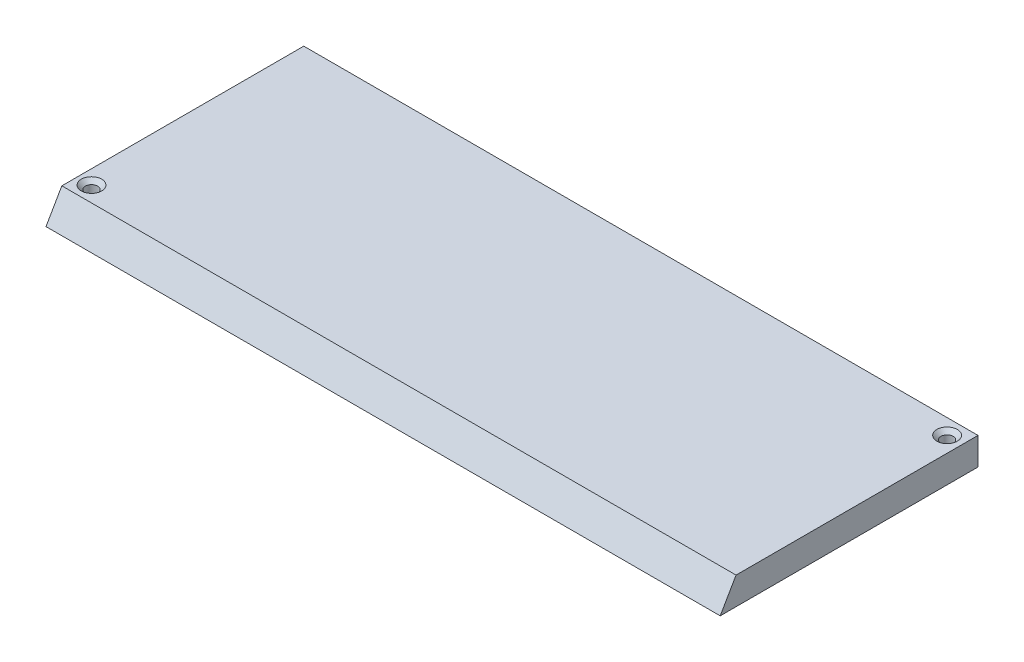
ISO-10303-21;
HEADER;
FILE_DESCRIPTION(('STEP AP214'),'2;1');
FILE_NAME('part.step','',(''),(''),'','','');
FILE_SCHEMA(('AUTOMOTIVE_DESIGN { 1 0 10303 214 1 1 1 1 }'));
ENDSEC;
DATA;
#1=APPLICATION_CONTEXT('core data for automotive mechanical design processes');
#2=APPLICATION_PROTOCOL_DEFINITION('international standard','automotive_design',2000,#1);
#3=PRODUCT_CONTEXT('',#1,'mechanical');
#4=PRODUCT('Part','Part','',(#3));
#5=PRODUCT_RELATED_PRODUCT_CATEGORY('part','',(#4));
#6=PRODUCT_DEFINITION_FORMATION('','',#4);
#7=PRODUCT_DEFINITION_CONTEXT('part definition',#1,'design');
#8=PRODUCT_DEFINITION('design','',#6,#7);
#9=PRODUCT_DEFINITION_SHAPE('','',#8);
#10=(LENGTH_UNIT() NAMED_UNIT(*) SI_UNIT(.MILLI.,.METRE.));
#11=(NAMED_UNIT(*) PLANE_ANGLE_UNIT() SI_UNIT($,.RADIAN.));
#12=(NAMED_UNIT(*) SI_UNIT($,.STERADIAN.) SOLID_ANGLE_UNIT());
#13=UNCERTAINTY_MEASURE_WITH_UNIT(LENGTH_MEASURE(1.E-05),#10,'distance_accuracy_value','');
#14=(GEOMETRIC_REPRESENTATION_CONTEXT(3) GLOBAL_UNCERTAINTY_ASSIGNED_CONTEXT((#13)) GLOBAL_UNIT_ASSIGNED_CONTEXT((#10,
#11,#12)) REPRESENTATION_CONTEXT('',''));
#15=CARTESIAN_POINT('',(0.,0.,0.));
#16=DIRECTION('',(0.,0.,1.));
#17=DIRECTION('',(1.,0.,0.));
#18=AXIS2_PLACEMENT_3D('',#15,#16,#17);
#19=CARTESIAN_POINT('',(0.,44.0009761145526,-0.000964457278402772));
#20=DIRECTION('',(0.,-0.999999999759779,2.19189973345185E-05));
#21=DIRECTION('',(0.,-2.19189973345185E-05,-0.999999999759779));
#22=AXIS2_PLACEMENT_3D('',#19,#20,#21);
#23=PLANE('',#22);
#24=CARTESIAN_POINT('',(193.442926912,43.998374470899,-118.694516600453));
#25=DIRECTION('',(0.,-0.999999999759779,2.19189973345185E-05));
#26=DIRECTION('',(0.,2.19189973345185E-05,0.999999999759779));
#27=AXIS2_PLACEMENT_3D('',#24,#25,#26);
#28=ELLIPSE('',#27,1.80000000043239,1.8);
#29=CARTESIAN_POINT('',(193.442926912,43.9984139250942,-116.894516600453));
#30=VERTEX_POINT('',#29);
#31=EDGE_CURVE('E41',#30,#30,#28,.T.);
#32=ORIENTED_EDGE('',*,*,#31,.F.);
#33=EDGE_LOOP('',(#32));
#34=FACE_BOUND('',#33,.T.);
#35=CARTESIAN_POINT('',(4.16488542546127,43.9997331425506,-56.7084854597657));
#36=DIRECTION('',(0.,-0.999999999759779,2.19189973345185E-05));
#37=DIRECTION('',(0.,2.19189973345185E-05,0.999999999759779));
#38=AXIS2_PLACEMENT_3D('',#35,#36,#37);
#39=ELLIPSE('',#38,1.80000000043239,1.79999999999999);
#40=CARTESIAN_POINT('',(4.16488542546127,43.9997725967458,-54.9084854597657));
#41=VERTEX_POINT('',#40);
#42=EDGE_CURVE('E95',#41,#41,#39,.T.);
#43=ORIENTED_EDGE('',*,*,#42,.F.);
#44=EDGE_LOOP('',(#43));
#45=FACE_BOUND('',#44,.T.);
#46=DIRECTION('',(1.,0.,0.));
#47=VECTOR('',#46,1.);
#48=CARTESIAN_POINT('',(0.,43.9999347591762,-47.5102259558685));
#49=LINE('',#48,#47);
#50=CARTESIAN_POINT('',(0.,43.9999347591762,-47.5102259558685));
#51=VERTEX_POINT('',#50);
#52=CARTESIAN_POINT('',(198.,43.9999347591762,-47.5102259558685));
#53=VERTEX_POINT('',#52);
#54=EDGE_CURVE('E82',#51,#53,#49,.T.);
#55=ORIENTED_EDGE('',*,*,#54,.F.);
#56=DIRECTION('',(0.,-2.19189973345185E-05,-0.999999999759779));
#57=VECTOR('',#56,1.);
#58=CARTESIAN_POINT('',(0.,44.0009761145526,-0.000964457278402773));
#59=LINE('',#58,#57);
#60=CARTESIAN_POINT('',(0.,43.9982754039967,-123.214198806139));
#61=VERTEX_POINT('',#60);
#62=EDGE_CURVE('E84',#51,#61,#59,.T.);
#63=ORIENTED_EDGE('',*,*,#62,.T.);
#64=DIRECTION('',(-1.,0.,0.));
#65=VECTOR('',#64,1.);
#66=CARTESIAN_POINT('',(0.,43.9982754039967,-123.214198806139));
#67=LINE('',#66,#65);
#68=CARTESIAN_POINT('',(198.,43.9982754039967,-123.214198806139));
#69=VERTEX_POINT('',#68);
#70=EDGE_CURVE('E74',#69,#61,#67,.T.);
#71=ORIENTED_EDGE('',*,*,#70,.F.);
#72=DIRECTION('',(0.,-2.19189973345185E-05,-0.999999999759779));
#73=VECTOR('',#72,1.);
#74=CARTESIAN_POINT('',(198.,44.0009761145526,-0.000964457278402773));
#75=LINE('',#74,#73);
#76=EDGE_CURVE('E86',#53,#69,#75,.T.);
#77=ORIENTED_EDGE('',*,*,#76,.F.);
#78=EDGE_LOOP('',(#55,#63,#71,#77));
#79=FACE_BOUND('',#78,.T.);
#80=ADVANCED_FACE('F37',(#34,#45,#79),#23,.T.);
#81=CARTESIAN_POINT('',(0.,52.0482754030357,-123.214198806139));
#82=DIRECTION('',(0.,1.,0.));
#83=DIRECTION('',(0.,0.,1.));
#84=AXIS2_PLACEMENT_3D('',#81,#82,#83);
#85=PLANE('',#84);
#86=CARTESIAN_POINT('',(193.442926912,52.0482754030357,-118.694516600453));
#87=DIRECTION('',(0.,1.,0.));
#88=DIRECTION('',(0.,0.,1.));
#89=AXIS2_PLACEMENT_3D('',#86,#87,#88);
#90=CIRCLE('',#89,3.);
#91=CARTESIAN_POINT('',(193.442926912,52.0482754030357,-115.694516600453));
#92=VERTEX_POINT('',#91);
#93=EDGE_CURVE('E238',#92,#92,#90,.T.);
#94=ORIENTED_EDGE('',*,*,#93,.F.);
#95=EDGE_LOOP('',(#94));
#96=FACE_BOUND('',#95,.T.);
#97=CARTESIAN_POINT('',(4.16488542546127,52.0482754030357,-56.7084854597657));
#98=DIRECTION('',(0.,1.,0.));
#99=DIRECTION('',(0.,0.,1.));
#100=AXIS2_PLACEMENT_3D('',#97,#98,#99);
#101=CIRCLE('',#100,3.);
#102=CARTESIAN_POINT('',(4.16488542546127,52.0482754030357,-53.7084854597657));
#103=VERTEX_POINT('',#102);
#104=EDGE_CURVE('E112',#103,#103,#101,.T.);
#105=ORIENTED_EDGE('',*,*,#104,.F.);
#106=EDGE_LOOP('',(#105));
#107=FACE_BOUND('',#106,.T.);
#108=DIRECTION('',(0.,0.,1.));
#109=VECTOR('',#108,1.);
#110=CARTESIAN_POINT('',(198.,52.0482754030357,-123.214198806139));
#111=LINE('',#110,#109);
#112=CARTESIAN_POINT('',(198.,52.0482754030357,-123.214198806139));
#113=VERTEX_POINT('',#112);
#114=CARTESIAN_POINT('',(198.,52.0482754030357,-52.1571728115169));
#115=VERTEX_POINT('',#114);
#116=EDGE_CURVE('E47',#113,#115,#111,.T.);
#117=ORIENTED_EDGE('',*,*,#116,.F.);
#118=DIRECTION('',(1.,0.,0.));
#119=VECTOR('',#118,1.);
#120=CARTESIAN_POINT('',(0.,52.0482754030357,-123.214198806139));
#121=LINE('',#120,#119);
#122=CARTESIAN_POINT('',(0.,52.0482754030357,-123.214198806139));
#123=VERTEX_POINT('',#122);
#124=EDGE_CURVE('E99',#123,#113,#121,.T.);
#125=ORIENTED_EDGE('',*,*,#124,.F.);
#126=DIRECTION('',(0.,0.,1.));
#127=VECTOR('',#126,1.);
#128=CARTESIAN_POINT('',(0.,52.0482754030357,-123.214198806139));
#129=LINE('',#128,#127);
#130=CARTESIAN_POINT('',(0.,52.0482754030357,-52.1571728115169));
#131=VERTEX_POINT('',#130);
#132=EDGE_CURVE('E98',#123,#131,#129,.T.);
#133=ORIENTED_EDGE('',*,*,#132,.T.);
#134=DIRECTION('',(1.,0.,0.));
#135=VECTOR('',#134,1.);
#136=CARTESIAN_POINT('',(0.,52.0482754030357,-52.1571728115169));
#137=LINE('',#136,#135);
#138=EDGE_CURVE('E65',#131,#115,#137,.T.);
#139=ORIENTED_EDGE('',*,*,#138,.T.);
#140=EDGE_LOOP('',(#117,#125,#133,#139));
#141=FACE_BOUND('',#140,.T.);
#142=ADVANCED_FACE('F127',(#96,#107,#141),#85,.T.);
#143=CARTESIAN_POINT('',(0.,0.,0.));
#144=DIRECTION('',(1.,0.,0.));
#145=DIRECTION('',(0.,0.,-1.));
#146=AXIS2_PLACEMENT_3D('',#143,#144,#145);
#147=PLANE('',#146);
#148=ORIENTED_EDGE('',*,*,#62,.F.);
#149=DIRECTION('',(0.,-0.866014444077731,0.500018982288411));
#150=VECTOR('',#149,1.);
#151=CARTESIAN_POINT('',(0.,39.9999853798931,-45.2007372036753));
#152=LINE('',#151,#150);
#153=EDGE_CURVE('E93',#131,#51,#152,.T.);
#154=ORIENTED_EDGE('',*,*,#153,.F.);
#155=ORIENTED_EDGE('',*,*,#132,.F.);
#156=DIRECTION('',(0.,1.,0.));
#157=VECTOR('',#156,1.);
#158=CARTESIAN_POINT('',(0.,39.9982754030357,-123.214198806139));
#159=LINE('',#158,#157);
#160=EDGE_CURVE('E94',#61,#123,#159,.T.);
#161=ORIENTED_EDGE('',*,*,#160,.F.);
#162=EDGE_LOOP('',(#148,#154,#155,#161));
#163=FACE_BOUND('',#162,.T.);
#164=ADVANCED_FACE('F91',(#163),#147,.F.);
#165=CARTESIAN_POINT('',(198.,0.,0.));
#166=DIRECTION('',(1.,0.,0.));
#167=DIRECTION('',(0.,0.,-1.));
#168=AXIS2_PLACEMENT_3D('',#165,#166,#167);
#169=PLANE('',#168);
#170=DIRECTION('',(0.,-0.866014444077731,0.500018982288411));
#171=VECTOR('',#170,1.);
#172=CARTESIAN_POINT('',(198.,39.9999853798931,-45.2007372036753));
#173=LINE('',#172,#171);
#174=EDGE_CURVE('E106',#115,#53,#173,.T.);
#175=ORIENTED_EDGE('',*,*,#174,.T.);
#176=ORIENTED_EDGE('',*,*,#76,.T.);
#177=DIRECTION('',(0.,1.,0.));
#178=VECTOR('',#177,1.);
#179=CARTESIAN_POINT('',(198.,39.9982754030357,-123.214198806139));
#180=LINE('',#179,#178);
#181=EDGE_CURVE('E11',#69,#113,#180,.T.);
#182=ORIENTED_EDGE('',*,*,#181,.T.);
#183=ORIENTED_EDGE('',*,*,#116,.T.);
#184=EDGE_LOOP('',(#175,#176,#182,#183));
#185=FACE_BOUND('',#184,.T.);
#186=ADVANCED_FACE('F122',(#185),#169,.T.);
#187=CARTESIAN_POINT('',(0.,39.9982754030357,-123.214198806139));
#188=DIRECTION('',(0.,0.,-1.));
#189=DIRECTION('',(-1.,0.,0.));
#190=AXIS2_PLACEMENT_3D('',#187,#188,#189);
#191=PLANE('',#190);
#192=ORIENTED_EDGE('',*,*,#181,.F.);
#193=ORIENTED_EDGE('',*,*,#70,.T.);
#194=ORIENTED_EDGE('',*,*,#160,.T.);
#195=ORIENTED_EDGE('',*,*,#124,.T.);
#196=EDGE_LOOP('',(#192,#193,#194,#195));
#197=FACE_BOUND('',#196,.T.);
#198=ADVANCED_FACE('F39',(#197),#191,.T.);
#199=CARTESIAN_POINT('',(0.,39.9999853798931,-45.2007372036753));
#200=DIRECTION('',(0.,0.500018982288411,0.866014444077731));
#201=DIRECTION('',(0.,-0.866014444077731,0.500018982288411));
#202=AXIS2_PLACEMENT_3D('',#199,#200,#201);
#203=PLANE('',#202);
#204=ORIENTED_EDGE('',*,*,#153,.T.);
#205=ORIENTED_EDGE('',*,*,#54,.T.);
#206=ORIENTED_EDGE('',*,*,#174,.F.);
#207=ORIENTED_EDGE('',*,*,#138,.F.);
#208=EDGE_LOOP('',(#204,#205,#206,#207));
#209=FACE_BOUND('',#208,.T.);
#210=ADVANCED_FACE('F97',(#209),#203,.T.);
#211=CARTESIAN_POINT('',(4.16488542546127,52.0482754030357,-56.7084854597657));
#212=DIRECTION('',(0.,1.,0.));
#213=DIRECTION('',(0.,0.,1.));
#214=AXIS2_PLACEMENT_3D('',#211,#212,#213);
#215=CYLINDRICAL_SURFACE('',#214,1.79999999999999);
#216=ORIENTED_EDGE('',*,*,#42,.T.);
#217=EDGE_LOOP('',(#216));
#218=FACE_BOUND('',#217,.T.);
#219=CARTESIAN_POINT('',(4.16488542546127,50.8894488732673,-56.7084854597657));
#220=DIRECTION('',(0.,1.,0.));
#221=DIRECTION('',(0.,0.,1.));
#222=AXIS2_PLACEMENT_3D('',#219,#220,#221);
#223=CIRCLE('',#222,1.8);
#224=CARTESIAN_POINT('',(4.16488542546127,50.8894488732673,-54.9084854597657));
#225=VERTEX_POINT('',#224);
#226=EDGE_CURVE('E108',#225,#225,#223,.T.);
#227=ORIENTED_EDGE('',*,*,#226,.T.);
#228=EDGE_LOOP('',(#227));
#229=FACE_BOUND('',#228,.T.);
#230=ADVANCED_FACE('F138',(#218,#229),#215,.F.);
#231=CARTESIAN_POINT('',(4.16488542546127,52.0482754030357,-56.7084854597657));
#232=DIRECTION('',(0.,1.,0.));
#233=DIRECTION('',(0.,0.,1.));
#234=AXIS2_PLACEMENT_3D('',#231,#232,#233);
#235=CONICAL_SURFACE('',#234,3.,0.802851455917389);
#236=ORIENTED_EDGE('',*,*,#226,.F.);
#237=EDGE_LOOP('',(#236));
#238=FACE_BOUND('',#237,.T.);
#239=ORIENTED_EDGE('',*,*,#104,.T.);
#240=EDGE_LOOP('',(#239));
#241=FACE_BOUND('',#240,.T.);
#242=ADVANCED_FACE('F150',(#238,#241),#235,.F.);
#243=CARTESIAN_POINT('',(193.442926912,52.0482754030357,-118.694516600453));
#244=DIRECTION('',(0.,1.,0.));
#245=DIRECTION('',(0.,0.,1.));
#246=AXIS2_PLACEMENT_3D('',#243,#244,#245);
#247=CYLINDRICAL_SURFACE('',#246,1.8);
#248=ORIENTED_EDGE('',*,*,#31,.T.);
#249=EDGE_LOOP('',(#248));
#250=FACE_BOUND('',#249,.T.);
#251=CARTESIAN_POINT('',(193.442926912,50.8894488732673,-118.694516600453));
#252=DIRECTION('',(0.,1.,0.));
#253=DIRECTION('',(0.,0.,1.));
#254=AXIS2_PLACEMENT_3D('',#251,#252,#253);
#255=CIRCLE('',#254,1.8);
#256=CARTESIAN_POINT('',(193.442926912,50.8894488732673,-116.894516600453));
#257=VERTEX_POINT('',#256);
#258=EDGE_CURVE('E236',#257,#257,#255,.T.);
#259=ORIENTED_EDGE('',*,*,#258,.T.);
#260=EDGE_LOOP('',(#259));
#261=FACE_BOUND('',#260,.T.);
#262=ADVANCED_FACE('F205',(#250,#261),#247,.F.);
#263=CARTESIAN_POINT('',(193.442926912,52.0482754030357,-118.694516600453));
#264=DIRECTION('',(0.,1.,0.));
#265=DIRECTION('',(0.,0.,1.));
#266=AXIS2_PLACEMENT_3D('',#263,#264,#265);
#267=CONICAL_SURFACE('',#266,3.,0.802851455917392);
#268=ORIENTED_EDGE('',*,*,#258,.F.);
#269=EDGE_LOOP('',(#268));
#270=FACE_BOUND('',#269,.T.);
#271=ORIENTED_EDGE('',*,*,#93,.T.);
#272=EDGE_LOOP('',(#271));
#273=FACE_BOUND('',#272,.T.);
#274=ADVANCED_FACE('F215',(#270,#273),#267,.F.);
#275=CLOSED_SHELL('',(#80,#142,#164,#186,#198,#210,#230,#242,#262,#274));
#276=MANIFOLD_SOLID_BREP('B2',#275);
#277=ADVANCED_BREP_SHAPE_REPRESENTATION('',(#18,#276),#14);
#278=SHAPE_DEFINITION_REPRESENTATION(#9,#277);
ENDSEC;
END-ISO-10303-21;
